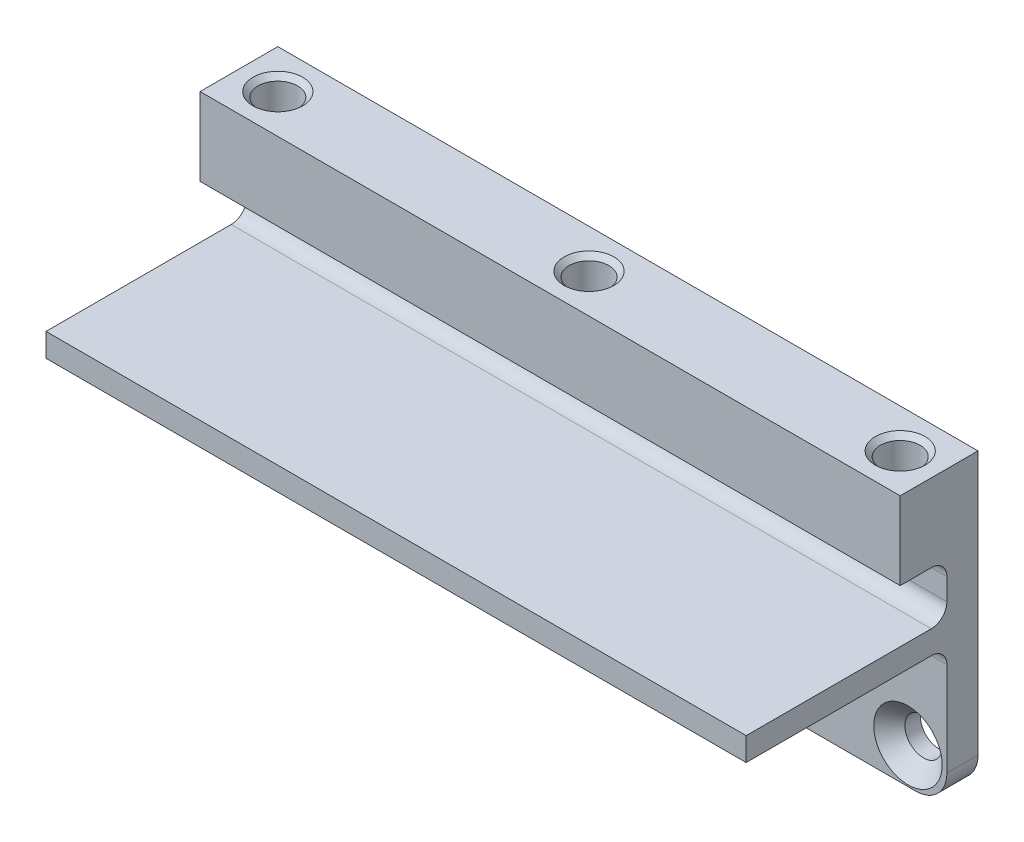
ISO-10303-21;
HEADER;
FILE_DESCRIPTION(('STEP AP214'),'2;1');
FILE_NAME('part.step','',(''),(''),'','','');
FILE_SCHEMA(('AUTOMOTIVE_DESIGN { 1 0 10303 214 1 1 1 1 }'));
ENDSEC;
DATA;
#1=APPLICATION_CONTEXT('core data for automotive mechanical design processes');
#2=APPLICATION_PROTOCOL_DEFINITION('international standard','automotive_design',2000,#1);
#3=PRODUCT_CONTEXT('',#1,'mechanical');
#4=PRODUCT('Part','Part','',(#3));
#5=PRODUCT_RELATED_PRODUCT_CATEGORY('part','',(#4));
#6=PRODUCT_DEFINITION_FORMATION('','',#4);
#7=PRODUCT_DEFINITION_CONTEXT('part definition',#1,'design');
#8=PRODUCT_DEFINITION('design','',#6,#7);
#9=PRODUCT_DEFINITION_SHAPE('','',#8);
#10=(LENGTH_UNIT() NAMED_UNIT(*) SI_UNIT(.MILLI.,.METRE.));
#11=(NAMED_UNIT(*) PLANE_ANGLE_UNIT() SI_UNIT($,.RADIAN.));
#12=(NAMED_UNIT(*) SI_UNIT($,.STERADIAN.) SOLID_ANGLE_UNIT());
#13=UNCERTAINTY_MEASURE_WITH_UNIT(LENGTH_MEASURE(1.E-05),#10,'distance_accuracy_value','');
#14=(GEOMETRIC_REPRESENTATION_CONTEXT(3) GLOBAL_UNCERTAINTY_ASSIGNED_CONTEXT((#13)) GLOBAL_UNIT_ASSIGNED_CONTEXT((#10,
#11,#12)) REPRESENTATION_CONTEXT('',''));
#15=CARTESIAN_POINT('',(0.,0.,0.));
#16=DIRECTION('',(0.,0.,1.));
#17=DIRECTION('',(1.,0.,0.));
#18=AXIS2_PLACEMENT_3D('',#15,#16,#17);
#19=CARTESIAN_POINT('',(22.5,0.,2.));
#20=DIRECTION('',(0.,1.,0.));
#21=DIRECTION('',(0.,0.,1.));
#22=AXIS2_PLACEMENT_3D('',#19,#20,#21);
#23=PLANE('',#22);
#24=DIRECTION('',(-1.,0.,0.));
#25=VECTOR('',#24,1.);
#26=CARTESIAN_POINT('',(22.5,0.,2.));
#27=LINE('',#26,#25);
#28=CARTESIAN_POINT('',(20.5,0.,2.));
#29=VERTEX_POINT('',#28);
#30=CARTESIAN_POINT('',(-20.5,0.,2.));
#31=VERTEX_POINT('',#30);
#32=EDGE_CURVE('E261',#29,#31,#27,.T.);
#33=ORIENTED_EDGE('',*,*,#32,.T.);
#34=DIRECTION('',(0.,0.,-1.));
#35=VECTOR('',#34,1.);
#36=CARTESIAN_POINT('',(-20.5,0.,2.));
#37=LINE('',#36,#35);
#38=CARTESIAN_POINT('',(-20.5,0.,0.));
#39=VERTEX_POINT('',#38);
#40=EDGE_CURVE('E369',#31,#39,#37,.T.);
#41=ORIENTED_EDGE('',*,*,#40,.T.);
#42=DIRECTION('',(-1.,0.,0.));
#43=VECTOR('',#42,1.);
#44=CARTESIAN_POINT('',(22.5,0.,0.));
#45=LINE('',#44,#43);
#46=CARTESIAN_POINT('',(20.5,0.,0.));
#47=VERTEX_POINT('',#46);
#48=EDGE_CURVE('E314',#47,#39,#45,.T.);
#49=ORIENTED_EDGE('',*,*,#48,.F.);
#50=DIRECTION('',(0.,0.,-1.));
#51=VECTOR('',#50,1.);
#52=CARTESIAN_POINT('',(20.5,0.,2.));
#53=LINE('',#52,#51);
#54=EDGE_CURVE('E357',#47,#29,#53,.F.);
#55=ORIENTED_EDGE('',*,*,#54,.T.);
#56=EDGE_LOOP('',(#33,#41,#49,#55));
#57=FACE_BOUND('',#56,.T.);
#58=ADVANCED_FACE('F41',(#57),#23,.F.);
#59=CARTESIAN_POINT('',(22.5,0.,0.));
#60=DIRECTION('',(0.,0.,1.));
#61=DIRECTION('',(1.,0.,0.));
#62=AXIS2_PLACEMENT_3D('',#59,#60,#61);
#63=PLANE('',#62);
#64=CARTESIAN_POINT('',(-20.,2.3,0.));
#65=DIRECTION('',(0.,0.,1.));
#66=DIRECTION('',(1.,0.,0.));
#67=AXIS2_PLACEMENT_3D('',#64,#65,#66);
#68=CIRCLE('',#67,1.19999999999999);
#69=CARTESIAN_POINT('',(-18.8,2.3,0.));
#70=VERTEX_POINT('',#69);
#71=EDGE_CURVE('E211',#70,#70,#68,.T.);
#72=ORIENTED_EDGE('',*,*,#71,.T.);
#73=EDGE_LOOP('',(#72));
#74=FACE_BOUND('',#73,.T.);
#75=CARTESIAN_POINT('',(0.,2.3,0.));
#76=DIRECTION('',(0.,0.,1.));
#77=DIRECTION('',(1.,0.,0.));
#78=AXIS2_PLACEMENT_3D('',#75,#76,#77);
#79=CIRCLE('',#78,1.19999999999999);
#80=CARTESIAN_POINT('',(1.19999999999999,2.3,0.));
#81=VERTEX_POINT('',#80);
#82=EDGE_CURVE('E220',#81,#81,#79,.T.);
#83=ORIENTED_EDGE('',*,*,#82,.T.);
#84=EDGE_LOOP('',(#83));
#85=FACE_BOUND('',#84,.T.);
#86=CARTESIAN_POINT('',(20.,2.3,0.));
#87=DIRECTION('',(0.,0.,1.));
#88=DIRECTION('',(1.,0.,0.));
#89=AXIS2_PLACEMENT_3D('',#86,#87,#88);
#90=CIRCLE('',#89,1.19999999999999);
#91=CARTESIAN_POINT('',(21.2,2.3,0.));
#92=VERTEX_POINT('',#91);
#93=EDGE_CURVE('E229',#92,#92,#90,.T.);
#94=ORIENTED_EDGE('',*,*,#93,.T.);
#95=EDGE_LOOP('',(#94));
#96=FACE_BOUND('',#95,.T.);
#97=ORIENTED_EDGE('',*,*,#48,.T.);
#98=CARTESIAN_POINT('',(-20.5,2.,0.));
#99=DIRECTION('',(0.,0.,1.));
#100=DIRECTION('',(1.,0.,0.));
#101=AXIS2_PLACEMENT_3D('',#98,#99,#100);
#102=CIRCLE('',#101,2.);
#103=CARTESIAN_POINT('',(-22.5,2.,0.));
#104=VERTEX_POINT('',#103);
#105=EDGE_CURVE('E376',#39,#104,#102,.F.);
#106=ORIENTED_EDGE('',*,*,#105,.T.);
#107=DIRECTION('',(0.,1.,0.));
#108=VECTOR('',#107,1.);
#109=CARTESIAN_POINT('',(-22.5,0.,0.));
#110=LINE('',#109,#108);
#111=CARTESIAN_POINT('',(-22.5,18.94,0.));
#112=VERTEX_POINT('',#111);
#113=EDGE_CURVE('E262',#104,#112,#110,.T.);
#114=ORIENTED_EDGE('',*,*,#113,.T.);
#115=DIRECTION('',(-1.,0.,0.));
#116=VECTOR('',#115,1.);
#117=CARTESIAN_POINT('',(22.5,18.94,0.));
#118=LINE('',#117,#116);
#119=CARTESIAN_POINT('',(22.5,18.94,0.));
#120=VERTEX_POINT('',#119);
#121=EDGE_CURVE('E310',#120,#112,#118,.T.);
#122=ORIENTED_EDGE('',*,*,#121,.F.);
#123=DIRECTION('',(0.,1.,0.));
#124=VECTOR('',#123,1.);
#125=CARTESIAN_POINT('',(22.5,0.,0.));
#126=LINE('',#125,#124);
#127=CARTESIAN_POINT('',(22.5,2.,0.));
#128=VERTEX_POINT('',#127);
#129=EDGE_CURVE('E230',#128,#120,#126,.T.);
#130=ORIENTED_EDGE('',*,*,#129,.F.);
#131=CARTESIAN_POINT('',(20.5,2.,0.));
#132=DIRECTION('',(0.,0.,1.));
#133=DIRECTION('',(1.,0.,0.));
#134=AXIS2_PLACEMENT_3D('',#131,#132,#133);
#135=CIRCLE('',#134,2.);
#136=EDGE_CURVE('E373',#128,#47,#135,.F.);
#137=ORIENTED_EDGE('',*,*,#136,.T.);
#138=EDGE_LOOP('',(#97,#106,#114,#122,#130,#137));
#139=FACE_BOUND('',#138,.T.);
#140=ADVANCED_FACE('F392',(#74,#85,#96,#139),#63,.F.);
#141=CARTESIAN_POINT('',(22.5,18.94,0.));
#142=DIRECTION('',(0.,-1.,0.));
#143=DIRECTION('',(0.,0.,-1.));
#144=AXIS2_PLACEMENT_3D('',#141,#142,#143);
#145=PLANE('',#144);
#146=CARTESIAN_POINT('',(-20.,18.94,2.5));
#147=DIRECTION('',(0.,1.,0.));
#148=DIRECTION('',(0.,0.,1.));
#149=AXIS2_PLACEMENT_3D('',#146,#147,#148);
#150=CIRCLE('',#149,1.5975);
#151=CARTESIAN_POINT('',(-20.,18.94,4.0975));
#152=VERTEX_POINT('',#151);
#153=EDGE_CURVE('E180',#152,#152,#150,.T.);
#154=ORIENTED_EDGE('',*,*,#153,.F.);
#155=EDGE_LOOP('',(#154));
#156=FACE_BOUND('',#155,.T.);
#157=CARTESIAN_POINT('',(0.,18.94,2.5));
#158=DIRECTION('',(0.,1.,0.));
#159=DIRECTION('',(0.,0.,1.));
#160=AXIS2_PLACEMENT_3D('',#157,#158,#159);
#161=CIRCLE('',#160,1.5975);
#162=CARTESIAN_POINT('',(0.,18.94,4.0975));
#163=VERTEX_POINT('',#162);
#164=EDGE_CURVE('E171',#163,#163,#161,.T.);
#165=ORIENTED_EDGE('',*,*,#164,.F.);
#166=EDGE_LOOP('',(#165));
#167=FACE_BOUND('',#166,.T.);
#168=CARTESIAN_POINT('',(20.,18.94,2.5));
#169=DIRECTION('',(0.,1.,0.));
#170=DIRECTION('',(0.,0.,1.));
#171=AXIS2_PLACEMENT_3D('',#168,#169,#170);
#172=CIRCLE('',#171,1.5975);
#173=CARTESIAN_POINT('',(20.,18.94,4.0975));
#174=VERTEX_POINT('',#173);
#175=EDGE_CURVE('E191',#174,#174,#172,.T.);
#176=ORIENTED_EDGE('',*,*,#175,.F.);
#177=EDGE_LOOP('',(#176));
#178=FACE_BOUND('',#177,.T.);
#179=DIRECTION('',(0.,0.,1.));
#180=VECTOR('',#179,1.);
#181=CARTESIAN_POINT('',(-22.5,18.94,0.));
#182=LINE('',#181,#180);
#183=CARTESIAN_POINT('',(-22.5,18.94,5.));
#184=VERTEX_POINT('',#183);
#185=EDGE_CURVE('E265',#112,#184,#182,.T.);
#186=ORIENTED_EDGE('',*,*,#185,.T.);
#187=DIRECTION('',(-1.,0.,0.));
#188=VECTOR('',#187,1.);
#189=CARTESIAN_POINT('',(22.5,18.94,5.));
#190=LINE('',#189,#188);
#191=CARTESIAN_POINT('',(22.5,18.94,5.));
#192=VERTEX_POINT('',#191);
#193=EDGE_CURVE('E306',#192,#184,#190,.T.);
#194=ORIENTED_EDGE('',*,*,#193,.F.);
#195=DIRECTION('',(0.,0.,1.));
#196=VECTOR('',#195,1.);
#197=CARTESIAN_POINT('',(22.5,18.94,0.));
#198=LINE('',#197,#196);
#199=EDGE_CURVE('E233',#120,#192,#198,.T.);
#200=ORIENTED_EDGE('',*,*,#199,.F.);
#201=ORIENTED_EDGE('',*,*,#121,.T.);
#202=EDGE_LOOP('',(#186,#194,#200,#201));
#203=FACE_BOUND('',#202,.T.);
#204=ADVANCED_FACE('F400',(#156,#167,#178,#203),#145,.F.);
#205=CARTESIAN_POINT('',(22.5,18.94,5.));
#206=DIRECTION('',(0.,0.,-1.));
#207=DIRECTION('',(-1.,0.,0.));
#208=AXIS2_PLACEMENT_3D('',#205,#206,#207);
#209=PLANE('',#208);
#210=DIRECTION('',(0.,-1.,0.));
#211=VECTOR('',#210,1.);
#212=CARTESIAN_POINT('',(-22.5,18.94,5.));
#213=LINE('',#212,#211);
#214=CARTESIAN_POINT('',(-22.5,13.94,5.));
#215=VERTEX_POINT('',#214);
#216=EDGE_CURVE('E268',#184,#215,#213,.T.);
#217=ORIENTED_EDGE('',*,*,#216,.T.);
#218=DIRECTION('',(-1.,0.,0.));
#219=VECTOR('',#218,1.);
#220=CARTESIAN_POINT('',(22.5,13.94,5.));
#221=LINE('',#220,#219);
#222=CARTESIAN_POINT('',(22.5,13.94,5.));
#223=VERTEX_POINT('',#222);
#224=EDGE_CURVE('E302',#223,#215,#221,.T.);
#225=ORIENTED_EDGE('',*,*,#224,.F.);
#226=DIRECTION('',(0.,-1.,0.));
#227=VECTOR('',#226,1.);
#228=CARTESIAN_POINT('',(22.5,18.94,5.));
#229=LINE('',#228,#227);
#230=EDGE_CURVE('E237',#192,#223,#229,.T.);
#231=ORIENTED_EDGE('',*,*,#230,.F.);
#232=ORIENTED_EDGE('',*,*,#193,.T.);
#233=EDGE_LOOP('',(#217,#225,#231,#232));
#234=FACE_BOUND('',#233,.T.);
#235=ADVANCED_FACE('F404',(#234),#209,.F.);
#236=CARTESIAN_POINT('',(22.5,13.94,5.));
#237=DIRECTION('',(0.,1.,0.));
#238=DIRECTION('',(0.,0.,1.));
#239=AXIS2_PLACEMENT_3D('',#236,#237,#238);
#240=PLANE('',#239);
#241=DIRECTION('',(0.,0.,-1.));
#242=VECTOR('',#241,1.);
#243=CARTESIAN_POINT('',(-22.5,13.94,5.));
#244=LINE('',#243,#242);
#245=CARTESIAN_POINT('',(-22.5,13.94,3.));
#246=VERTEX_POINT('',#245);
#247=EDGE_CURVE('E271',#215,#246,#244,.T.);
#248=ORIENTED_EDGE('',*,*,#247,.T.);
#249=DIRECTION('',(-1.,0.,0.));
#250=VECTOR('',#249,1.);
#251=CARTESIAN_POINT('',(22.5,13.94,3.));
#252=LINE('',#251,#250);
#253=CARTESIAN_POINT('',(22.5,13.94,3.));
#254=VERTEX_POINT('',#253);
#255=EDGE_CURVE('E336',#246,#254,#252,.F.);
#256=ORIENTED_EDGE('',*,*,#255,.T.);
#257=DIRECTION('',(0.,0.,-1.));
#258=VECTOR('',#257,1.);
#259=CARTESIAN_POINT('',(22.5,13.94,5.));
#260=LINE('',#259,#258);
#261=EDGE_CURVE('E240',#223,#254,#260,.T.);
#262=ORIENTED_EDGE('',*,*,#261,.F.);
#263=ORIENTED_EDGE('',*,*,#224,.T.);
#264=EDGE_LOOP('',(#248,#256,#262,#263));
#265=FACE_BOUND('',#264,.T.);
#266=ADVANCED_FACE('F491',(#265),#240,.F.);
#267=CARTESIAN_POINT('',(22.5,13.94,2.));
#268=DIRECTION('',(0.,0.,-1.));
#269=DIRECTION('',(0.,1.,0.));
#270=AXIS2_PLACEMENT_3D('',#267,#268,#269);
#271=PLANE('',#270);
#272=DIRECTION('',(0.,-1.,0.));
#273=VECTOR('',#272,1.);
#274=CARTESIAN_POINT('',(-22.5,13.94,2.));
#275=LINE('',#274,#273);
#276=CARTESIAN_POINT('',(-22.5,12.94,2.));
#277=VERTEX_POINT('',#276);
#278=CARTESIAN_POINT('',(-22.5,11.54,2.));
#279=VERTEX_POINT('',#278);
#280=EDGE_CURVE('E275',#277,#279,#275,.T.);
#281=ORIENTED_EDGE('',*,*,#280,.T.);
#282=DIRECTION('',(-1.,0.,0.));
#283=VECTOR('',#282,1.);
#284=CARTESIAN_POINT('',(22.5,11.54,2.));
#285=LINE('',#284,#283);
#286=CARTESIAN_POINT('',(22.5,11.54,2.));
#287=VERTEX_POINT('',#286);
#288=EDGE_CURVE('E326',#279,#287,#285,.F.);
#289=ORIENTED_EDGE('',*,*,#288,.T.);
#290=DIRECTION('',(0.,-1.,0.));
#291=VECTOR('',#290,1.);
#292=CARTESIAN_POINT('',(22.5,13.94,2.));
#293=LINE('',#292,#291);
#294=CARTESIAN_POINT('',(22.5,12.94,2.));
#295=VERTEX_POINT('',#294);
#296=EDGE_CURVE('E244',#295,#287,#293,.T.);
#297=ORIENTED_EDGE('',*,*,#296,.F.);
#298=DIRECTION('',(-1.,0.,0.));
#299=VECTOR('',#298,1.);
#300=CARTESIAN_POINT('',(-22.5,12.94,2.));
#301=LINE('',#300,#299);
#302=EDGE_CURVE('E322',#295,#277,#301,.T.);
#303=ORIENTED_EDGE('',*,*,#302,.T.);
#304=EDGE_LOOP('',(#281,#289,#297,#303));
#305=FACE_BOUND('',#304,.T.);
#306=ADVANCED_FACE('F455',(#305),#271,.F.);
#307=CARTESIAN_POINT('',(22.5,10.54,2.));
#308=DIRECTION('',(0.,-1.,0.));
#309=DIRECTION('',(0.,0.,-1.));
#310=AXIS2_PLACEMENT_3D('',#307,#308,#309);
#311=PLANE('',#310);
#312=DIRECTION('',(0.,0.,1.));
#313=VECTOR('',#312,1.);
#314=CARTESIAN_POINT('',(22.5,10.54,2.));
#315=LINE('',#314,#313);
#316=CARTESIAN_POINT('',(22.5,10.54,3.));
#317=VERTEX_POINT('',#316);
#318=CARTESIAN_POINT('',(22.5,10.54,14.9));
#319=VERTEX_POINT('',#318);
#320=EDGE_CURVE('E248',#317,#319,#315,.T.);
#321=ORIENTED_EDGE('',*,*,#320,.F.);
#322=DIRECTION('',(-1.,0.,0.));
#323=VECTOR('',#322,1.);
#324=CARTESIAN_POINT('',(-22.5,10.54,3.));
#325=LINE('',#324,#323);
#326=CARTESIAN_POINT('',(-22.5,10.54,3.));
#327=VERTEX_POINT('',#326);
#328=EDGE_CURVE('E318',#317,#327,#325,.T.);
#329=ORIENTED_EDGE('',*,*,#328,.T.);
#330=DIRECTION('',(0.,0.,1.));
#331=VECTOR('',#330,1.);
#332=CARTESIAN_POINT('',(-22.5,10.54,2.));
#333=LINE('',#332,#331);
#334=CARTESIAN_POINT('',(-22.5,10.54,14.9));
#335=VERTEX_POINT('',#334);
#336=EDGE_CURVE('E279',#327,#335,#333,.T.);
#337=ORIENTED_EDGE('',*,*,#336,.T.);
#338=DIRECTION('',(-1.,0.,0.));
#339=VECTOR('',#338,1.);
#340=CARTESIAN_POINT('',(22.5,10.54,14.9));
#341=LINE('',#340,#339);
#342=EDGE_CURVE('E298',#319,#335,#341,.T.);
#343=ORIENTED_EDGE('',*,*,#342,.F.);
#344=EDGE_LOOP('',(#321,#329,#337,#343));
#345=FACE_BOUND('',#344,.T.);
#346=ADVANCED_FACE('F462',(#345),#311,.F.);
#347=CARTESIAN_POINT('',(22.5,10.54,14.9));
#348=DIRECTION('',(0.,0.,-1.));
#349=DIRECTION('',(0.,1.,0.));
#350=AXIS2_PLACEMENT_3D('',#347,#348,#349);
#351=PLANE('',#350);
#352=DIRECTION('',(0.,-1.,0.));
#353=VECTOR('',#352,1.);
#354=CARTESIAN_POINT('',(-22.5,10.54,14.9));
#355=LINE('',#354,#353);
#356=CARTESIAN_POINT('',(-22.5,9.04,14.9));
#357=VERTEX_POINT('',#356);
#358=EDGE_CURVE('E282',#335,#357,#355,.T.);
#359=ORIENTED_EDGE('',*,*,#358,.T.);
#360=DIRECTION('',(-1.,0.,0.));
#361=VECTOR('',#360,1.);
#362=CARTESIAN_POINT('',(22.5,9.04,14.9));
#363=LINE('',#362,#361);
#364=CARTESIAN_POINT('',(22.5,9.04,14.9));
#365=VERTEX_POINT('',#364);
#366=EDGE_CURVE('E294',#365,#357,#363,.T.);
#367=ORIENTED_EDGE('',*,*,#366,.F.);
#368=DIRECTION('',(0.,-1.,0.));
#369=VECTOR('',#368,1.);
#370=CARTESIAN_POINT('',(22.5,10.54,14.9));
#371=LINE('',#370,#369);
#372=EDGE_CURVE('E251',#319,#365,#371,.T.);
#373=ORIENTED_EDGE('',*,*,#372,.F.);
#374=ORIENTED_EDGE('',*,*,#342,.T.);
#375=EDGE_LOOP('',(#359,#367,#373,#374));
#376=FACE_BOUND('',#375,.T.);
#377=ADVANCED_FACE('F468',(#376),#351,.F.);
#378=CARTESIAN_POINT('',(22.5,9.04,14.9));
#379=DIRECTION('',(0.,1.,0.));
#380=DIRECTION('',(0.,0.,1.));
#381=AXIS2_PLACEMENT_3D('',#378,#379,#380);
#382=PLANE('',#381);
#383=DIRECTION('',(0.,0.,-1.));
#384=VECTOR('',#383,1.);
#385=CARTESIAN_POINT('',(-22.5,9.04,14.9));
#386=LINE('',#385,#384);
#387=CARTESIAN_POINT('',(-22.5,9.04,3.));
#388=VERTEX_POINT('',#387);
#389=EDGE_CURVE('E285',#357,#388,#386,.T.);
#390=ORIENTED_EDGE('',*,*,#389,.T.);
#391=DIRECTION('',(-1.,0.,0.));
#392=VECTOR('',#391,1.);
#393=CARTESIAN_POINT('',(22.5,9.04,3.));
#394=LINE('',#393,#392);
#395=CARTESIAN_POINT('',(22.5,9.04,3.));
#396=VERTEX_POINT('',#395);
#397=EDGE_CURVE('E333',#388,#396,#394,.F.);
#398=ORIENTED_EDGE('',*,*,#397,.T.);
#399=DIRECTION('',(0.,0.,-1.));
#400=VECTOR('',#399,1.);
#401=CARTESIAN_POINT('',(22.5,9.04,14.9));
#402=LINE('',#401,#400);
#403=EDGE_CURVE('E254',#365,#396,#402,.T.);
#404=ORIENTED_EDGE('',*,*,#403,.F.);
#405=ORIENTED_EDGE('',*,*,#366,.T.);
#406=EDGE_LOOP('',(#390,#398,#404,#405));
#407=FACE_BOUND('',#406,.T.);
#408=ADVANCED_FACE('F475',(#407),#382,.F.);
#409=CARTESIAN_POINT('',(22.5,9.04,2.));
#410=DIRECTION('',(0.,0.,-1.));
#411=DIRECTION('',(-1.,0.,0.));
#412=AXIS2_PLACEMENT_3D('',#409,#410,#411);
#413=PLANE('',#412);
#414=CARTESIAN_POINT('',(-20.,2.3,2.));
#415=DIRECTION('',(0.,0.,1.));
#416=DIRECTION('',(1.,0.,0.));
#417=AXIS2_PLACEMENT_3D('',#414,#415,#416);
#418=CIRCLE('',#417,2.2);
#419=CARTESIAN_POINT('',(-17.8,2.3,2.));
#420=VERTEX_POINT('',#419);
#421=EDGE_CURVE('E203',#420,#420,#418,.T.);
#422=ORIENTED_EDGE('',*,*,#421,.F.);
#423=EDGE_LOOP('',(#422));
#424=FACE_BOUND('',#423,.T.);
#425=CARTESIAN_POINT('',(0.,2.3,2.));
#426=DIRECTION('',(0.,0.,1.));
#427=DIRECTION('',(1.,0.,0.));
#428=AXIS2_PLACEMENT_3D('',#425,#426,#427);
#429=CIRCLE('',#428,2.2);
#430=CARTESIAN_POINT('',(2.2,2.3,2.));
#431=VERTEX_POINT('',#430);
#432=EDGE_CURVE('E212',#431,#431,#429,.T.);
#433=ORIENTED_EDGE('',*,*,#432,.F.);
#434=EDGE_LOOP('',(#433));
#435=FACE_BOUND('',#434,.T.);
#436=CARTESIAN_POINT('',(20.,2.3,2.));
#437=DIRECTION('',(0.,0.,1.));
#438=DIRECTION('',(1.,0.,0.));
#439=AXIS2_PLACEMENT_3D('',#436,#437,#438);
#440=CIRCLE('',#439,2.2);
#441=CARTESIAN_POINT('',(22.2,2.3,2.));
#442=VERTEX_POINT('',#441);
#443=EDGE_CURVE('E221',#442,#442,#440,.T.);
#444=ORIENTED_EDGE('',*,*,#443,.F.);
#445=EDGE_LOOP('',(#444));
#446=FACE_BOUND('',#445,.T.);
#447=DIRECTION('',(0.,-1.,0.));
#448=VECTOR('',#447,1.);
#449=CARTESIAN_POINT('',(-22.5,9.04,2.));
#450=LINE('',#449,#448);
#451=CARTESIAN_POINT('',(-22.5,8.04,2.));
#452=VERTEX_POINT('',#451);
#453=CARTESIAN_POINT('',(-22.5,2.,2.));
#454=VERTEX_POINT('',#453);
#455=EDGE_CURVE('E234',#452,#454,#450,.T.);
#456=ORIENTED_EDGE('',*,*,#455,.T.);
#457=CARTESIAN_POINT('',(-20.5,2.,2.));
#458=DIRECTION('',(0.,0.,-1.));
#459=DIRECTION('',(-1.,0.,0.));
#460=AXIS2_PLACEMENT_3D('',#457,#458,#459);
#461=CIRCLE('',#460,2.);
#462=EDGE_CURVE('E50',#454,#31,#461,.F.);
#463=ORIENTED_EDGE('',*,*,#462,.T.);
#464=ORIENTED_EDGE('',*,*,#32,.F.);
#465=CARTESIAN_POINT('',(20.5,2.,2.));
#466=DIRECTION('',(0.,0.,-1.));
#467=DIRECTION('',(-1.,0.,0.));
#468=AXIS2_PLACEMENT_3D('',#465,#466,#467);
#469=CIRCLE('',#468,2.);
#470=CARTESIAN_POINT('',(22.5,2.,2.));
#471=VERTEX_POINT('',#470);
#472=EDGE_CURVE('E57',#29,#471,#469,.F.);
#473=ORIENTED_EDGE('',*,*,#472,.T.);
#474=DIRECTION('',(0.,-1.,0.));
#475=VECTOR('',#474,1.);
#476=CARTESIAN_POINT('',(22.5,9.04,2.));
#477=LINE('',#476,#475);
#478=CARTESIAN_POINT('',(22.5,8.04,2.));
#479=VERTEX_POINT('',#478);
#480=EDGE_CURVE('E258',#479,#471,#477,.T.);
#481=ORIENTED_EDGE('',*,*,#480,.F.);
#482=DIRECTION('',(-1.,0.,0.));
#483=VECTOR('',#482,1.);
#484=CARTESIAN_POINT('',(-22.5,8.04,2.));
#485=LINE('',#484,#483);
#486=EDGE_CURVE('E329',#479,#452,#485,.T.);
#487=ORIENTED_EDGE('',*,*,#486,.T.);
#488=EDGE_LOOP('',(#456,#463,#464,#473,#481,#487));
#489=FACE_BOUND('',#488,.T.);
#490=ADVANCED_FACE('F384',(#424,#435,#446,#489),#413,.F.);
#491=CARTESIAN_POINT('',(22.5,0.,0.));
#492=DIRECTION('',(1.,0.,0.));
#493=DIRECTION('',(0.,0.,-1.));
#494=AXIS2_PLACEMENT_3D('',#491,#492,#493);
#495=PLANE('',#494);
#496=ORIENTED_EDGE('',*,*,#480,.T.);
#497=DIRECTION('',(0.,0.,-1.));
#498=VECTOR('',#497,1.);
#499=CARTESIAN_POINT('',(22.5,2.,0.));
#500=LINE('',#499,#498);
#501=EDGE_CURVE('E11',#471,#128,#500,.T.);
#502=ORIENTED_EDGE('',*,*,#501,.T.);
#503=ORIENTED_EDGE('',*,*,#129,.T.);
#504=ORIENTED_EDGE('',*,*,#199,.T.);
#505=ORIENTED_EDGE('',*,*,#230,.T.);
#506=ORIENTED_EDGE('',*,*,#261,.T.);
#507=CARTESIAN_POINT('',(22.5,12.94,3.));
#508=DIRECTION('',(1.,0.,0.));
#509=DIRECTION('',(0.,0.,-1.));
#510=AXIS2_PLACEMENT_3D('',#507,#508,#509);
#511=CIRCLE('',#510,1.);
#512=EDGE_CURVE('E354',#254,#295,#511,.F.);
#513=ORIENTED_EDGE('',*,*,#512,.T.);
#514=ORIENTED_EDGE('',*,*,#296,.T.);
#515=CARTESIAN_POINT('',(22.5,11.54,3.));
#516=DIRECTION('',(1.,0.,0.));
#517=DIRECTION('',(0.,0.,-1.));
#518=AXIS2_PLACEMENT_3D('',#515,#516,#517);
#519=CIRCLE('',#518,1.);
#520=EDGE_CURVE('E342',#287,#317,#519,.F.);
#521=ORIENTED_EDGE('',*,*,#520,.T.);
#522=ORIENTED_EDGE('',*,*,#320,.T.);
#523=ORIENTED_EDGE('',*,*,#372,.T.);
#524=ORIENTED_EDGE('',*,*,#403,.T.);
#525=CARTESIAN_POINT('',(22.5,8.04,3.));
#526=DIRECTION('',(1.,0.,0.));
#527=DIRECTION('',(0.,0.,-1.));
#528=AXIS2_PLACEMENT_3D('',#525,#526,#527);
#529=CIRCLE('',#528,1.);
#530=EDGE_CURVE('E348',#396,#479,#529,.F.);
#531=ORIENTED_EDGE('',*,*,#530,.T.);
#532=EDGE_LOOP('',(#496,#502,#503,#504,#505,#506,#513,#514,#521,#522,#523,#524,#531));
#533=FACE_BOUND('',#532,.T.);
#534=ADVANCED_FACE('F408',(#533),#495,.T.);
#535=CARTESIAN_POINT('',(-22.5,0.,0.));
#536=DIRECTION('',(1.,0.,0.));
#537=DIRECTION('',(0.,0.,-1.));
#538=AXIS2_PLACEMENT_3D('',#535,#536,#537);
#539=PLANE('',#538);
#540=ORIENTED_EDGE('',*,*,#113,.F.);
#541=DIRECTION('',(0.,0.,-1.));
#542=VECTOR('',#541,1.);
#543=CARTESIAN_POINT('',(-22.5,2.,0.));
#544=LINE('',#543,#542);
#545=EDGE_CURVE('E65',#104,#454,#544,.F.);
#546=ORIENTED_EDGE('',*,*,#545,.T.);
#547=ORIENTED_EDGE('',*,*,#455,.F.);
#548=CARTESIAN_POINT('',(-22.5,8.04,3.));
#549=DIRECTION('',(1.,0.,0.));
#550=DIRECTION('',(0.,0.,-1.));
#551=AXIS2_PLACEMENT_3D('',#548,#549,#550);
#552=CIRCLE('',#551,1.);
#553=EDGE_CURVE('E345',#452,#388,#552,.T.);
#554=ORIENTED_EDGE('',*,*,#553,.T.);
#555=ORIENTED_EDGE('',*,*,#389,.F.);
#556=ORIENTED_EDGE('',*,*,#358,.F.);
#557=ORIENTED_EDGE('',*,*,#336,.F.);
#558=CARTESIAN_POINT('',(-22.5,11.54,3.));
#559=DIRECTION('',(1.,0.,0.));
#560=DIRECTION('',(0.,0.,-1.));
#561=AXIS2_PLACEMENT_3D('',#558,#559,#560);
#562=CIRCLE('',#561,1.);
#563=EDGE_CURVE('E339',#327,#279,#562,.T.);
#564=ORIENTED_EDGE('',*,*,#563,.T.);
#565=ORIENTED_EDGE('',*,*,#280,.F.);
#566=CARTESIAN_POINT('',(-22.5,12.94,3.));
#567=DIRECTION('',(1.,0.,0.));
#568=DIRECTION('',(0.,0.,-1.));
#569=AXIS2_PLACEMENT_3D('',#566,#567,#568);
#570=CIRCLE('',#569,1.);
#571=EDGE_CURVE('E351',#277,#246,#570,.T.);
#572=ORIENTED_EDGE('',*,*,#571,.T.);
#573=ORIENTED_EDGE('',*,*,#247,.F.);
#574=ORIENTED_EDGE('',*,*,#216,.F.);
#575=ORIENTED_EDGE('',*,*,#185,.F.);
#576=EDGE_LOOP('',(#540,#546,#547,#554,#555,#556,#557,#564,#565,#572,#573,#574,#575));
#577=FACE_BOUND('',#576,.T.);
#578=ADVANCED_FACE('F395',(#577),#539,.F.);
#579=CARTESIAN_POINT('',(22.5,11.54,3.));
#580=DIRECTION('',(1.,0.,0.));
#581=DIRECTION('',(0.,0.,-1.));
#582=AXIS2_PLACEMENT_3D('',#579,#580,#581);
#583=CYLINDRICAL_SURFACE('',#582,1.);
#584=ORIENTED_EDGE('',*,*,#520,.F.);
#585=ORIENTED_EDGE('',*,*,#288,.F.);
#586=ORIENTED_EDGE('',*,*,#563,.F.);
#587=ORIENTED_EDGE('',*,*,#328,.F.);
#588=EDGE_LOOP('',(#584,#585,#586,#587));
#589=FACE_BOUND('',#588,.T.);
#590=ADVANCED_FACE('F432',(#589),#583,.F.);
#591=CARTESIAN_POINT('',(22.5,8.04,3.));
#592=DIRECTION('',(1.,0.,0.));
#593=DIRECTION('',(0.,0.,-1.));
#594=AXIS2_PLACEMENT_3D('',#591,#592,#593);
#595=CYLINDRICAL_SURFACE('',#594,1.);
#596=ORIENTED_EDGE('',*,*,#530,.F.);
#597=ORIENTED_EDGE('',*,*,#397,.F.);
#598=ORIENTED_EDGE('',*,*,#553,.F.);
#599=ORIENTED_EDGE('',*,*,#486,.F.);
#600=EDGE_LOOP('',(#596,#597,#598,#599));
#601=FACE_BOUND('',#600,.T.);
#602=ADVANCED_FACE('F435',(#601),#595,.F.);
#603=CARTESIAN_POINT('',(22.5,12.94,3.));
#604=DIRECTION('',(1.,0.,0.));
#605=DIRECTION('',(0.,0.,-1.));
#606=AXIS2_PLACEMENT_3D('',#603,#604,#605);
#607=CYLINDRICAL_SURFACE('',#606,1.);
#608=ORIENTED_EDGE('',*,*,#512,.F.);
#609=ORIENTED_EDGE('',*,*,#255,.F.);
#610=ORIENTED_EDGE('',*,*,#571,.F.);
#611=ORIENTED_EDGE('',*,*,#302,.F.);
#612=EDGE_LOOP('',(#608,#609,#610,#611));
#613=FACE_BOUND('',#612,.T.);
#614=ADVANCED_FACE('F439',(#613),#607,.F.);
#615=CARTESIAN_POINT('',(20.,2.3,2.));
#616=DIRECTION('',(0.,0.,1.));
#617=DIRECTION('',(1.,0.,0.));
#618=AXIS2_PLACEMENT_3D('',#615,#616,#617);
#619=CYLINDRICAL_SURFACE('',#618,1.19999999999999);
#620=CARTESIAN_POINT('',(20.,2.3,0.999999999999999));
#621=DIRECTION('',(0.,0.,1.));
#622=DIRECTION('',(1.,0.,0.));
#623=AXIS2_PLACEMENT_3D('',#620,#621,#622);
#624=CIRCLE('',#623,1.2);
#625=CARTESIAN_POINT('',(21.2,2.3,0.999999999999999));
#626=VERTEX_POINT('',#625);
#627=EDGE_CURVE('E225',#626,#626,#624,.T.);
#628=ORIENTED_EDGE('',*,*,#627,.T.);
#629=EDGE_LOOP('',(#628));
#630=FACE_BOUND('',#629,.T.);
#631=ORIENTED_EDGE('',*,*,#93,.F.);
#632=EDGE_LOOP('',(#631));
#633=FACE_BOUND('',#632,.T.);
#634=ADVANCED_FACE('F442',(#630,#633),#619,.F.);
#635=CARTESIAN_POINT('',(20.,2.3,2.));
#636=DIRECTION('',(0.,0.,1.));
#637=DIRECTION('',(1.,0.,0.));
#638=AXIS2_PLACEMENT_3D('',#635,#636,#637);
#639=CONICAL_SURFACE('',#638,2.2,0.785398163397447);
#640=ORIENTED_EDGE('',*,*,#627,.F.);
#641=EDGE_LOOP('',(#640));
#642=FACE_BOUND('',#641,.T.);
#643=ORIENTED_EDGE('',*,*,#443,.T.);
#644=EDGE_LOOP('',(#643));
#645=FACE_BOUND('',#644,.T.);
#646=ADVANCED_FACE('F447',(#642,#645),#639,.F.);
#647=CARTESIAN_POINT('',(0.,2.3,2.));
#648=DIRECTION('',(0.,0.,1.));
#649=DIRECTION('',(1.,0.,0.));
#650=AXIS2_PLACEMENT_3D('',#647,#648,#649);
#651=CYLINDRICAL_SURFACE('',#650,1.19999999999999);
#652=CARTESIAN_POINT('',(0.,2.3,0.999999999999999));
#653=DIRECTION('',(0.,0.,1.));
#654=DIRECTION('',(1.,0.,0.));
#655=AXIS2_PLACEMENT_3D('',#652,#653,#654);
#656=CIRCLE('',#655,1.2);
#657=CARTESIAN_POINT('',(1.2,2.3,0.999999999999999));
#658=VERTEX_POINT('',#657);
#659=EDGE_CURVE('E216',#658,#658,#656,.T.);
#660=ORIENTED_EDGE('',*,*,#659,.T.);
#661=EDGE_LOOP('',(#660));
#662=FACE_BOUND('',#661,.T.);
#663=ORIENTED_EDGE('',*,*,#82,.F.);
#664=EDGE_LOOP('',(#663));
#665=FACE_BOUND('',#664,.T.);
#666=ADVANCED_FACE('F534',(#662,#665),#651,.F.);
#667=CARTESIAN_POINT('',(0.,2.3,2.));
#668=DIRECTION('',(0.,0.,1.));
#669=DIRECTION('',(1.,0.,0.));
#670=AXIS2_PLACEMENT_3D('',#667,#668,#669);
#671=CONICAL_SURFACE('',#670,2.2,0.785398163397448);
#672=ORIENTED_EDGE('',*,*,#659,.F.);
#673=EDGE_LOOP('',(#672));
#674=FACE_BOUND('',#673,.T.);
#675=ORIENTED_EDGE('',*,*,#432,.T.);
#676=EDGE_LOOP('',(#675));
#677=FACE_BOUND('',#676,.T.);
#678=ADVANCED_FACE('F530',(#674,#677),#671,.F.);
#679=CARTESIAN_POINT('',(-20.,2.3,2.));
#680=DIRECTION('',(0.,0.,1.));
#681=DIRECTION('',(1.,0.,0.));
#682=AXIS2_PLACEMENT_3D('',#679,#680,#681);
#683=CYLINDRICAL_SURFACE('',#682,1.19999999999999);
#684=CARTESIAN_POINT('',(-20.,2.3,0.999999999999999));
#685=DIRECTION('',(0.,0.,1.));
#686=DIRECTION('',(1.,0.,0.));
#687=AXIS2_PLACEMENT_3D('',#684,#685,#686);
#688=CIRCLE('',#687,1.2);
#689=CARTESIAN_POINT('',(-18.8,2.3,0.999999999999999));
#690=VERTEX_POINT('',#689);
#691=EDGE_CURVE('E207',#690,#690,#688,.T.);
#692=ORIENTED_EDGE('',*,*,#691,.T.);
#693=EDGE_LOOP('',(#692));
#694=FACE_BOUND('',#693,.T.);
#695=ORIENTED_EDGE('',*,*,#71,.F.);
#696=EDGE_LOOP('',(#695));
#697=FACE_BOUND('',#696,.T.);
#698=ADVANCED_FACE('F526',(#694,#697),#683,.F.);
#699=CARTESIAN_POINT('',(-20.,2.3,2.));
#700=DIRECTION('',(0.,0.,1.));
#701=DIRECTION('',(1.,0.,0.));
#702=AXIS2_PLACEMENT_3D('',#699,#700,#701);
#703=CONICAL_SURFACE('',#702,2.2,0.785398163397447);
#704=ORIENTED_EDGE('',*,*,#691,.F.);
#705=EDGE_LOOP('',(#704));
#706=FACE_BOUND('',#705,.T.);
#707=ORIENTED_EDGE('',*,*,#421,.T.);
#708=EDGE_LOOP('',(#707));
#709=FACE_BOUND('',#708,.T.);
#710=ADVANCED_FACE('F422',(#706,#709),#703,.F.);
#711=CARTESIAN_POINT('',(-20.5,2.,2.));
#712=DIRECTION('',(0.,0.,-1.));
#713=DIRECTION('',(-1.,0.,0.));
#714=AXIS2_PLACEMENT_3D('',#711,#712,#713);
#715=CYLINDRICAL_SURFACE('',#714,2.);
#716=ORIENTED_EDGE('',*,*,#462,.F.);
#717=ORIENTED_EDGE('',*,*,#545,.F.);
#718=ORIENTED_EDGE('',*,*,#105,.F.);
#719=ORIENTED_EDGE('',*,*,#40,.F.);
#720=EDGE_LOOP('',(#716,#717,#718,#719));
#721=FACE_BOUND('',#720,.T.);
#722=ADVANCED_FACE('F390',(#721),#715,.T.);
#723=CARTESIAN_POINT('',(20.5,2.,0.));
#724=DIRECTION('',(0.,0.,1.));
#725=DIRECTION('',(1.,0.,0.));
#726=AXIS2_PLACEMENT_3D('',#723,#724,#725);
#727=CYLINDRICAL_SURFACE('',#726,2.);
#728=ORIENTED_EDGE('',*,*,#472,.F.);
#729=ORIENTED_EDGE('',*,*,#54,.F.);
#730=ORIENTED_EDGE('',*,*,#136,.F.);
#731=ORIENTED_EDGE('',*,*,#501,.F.);
#732=EDGE_LOOP('',(#728,#729,#730,#731));
#733=FACE_BOUND('',#732,.T.);
#734=ADVANCED_FACE('F43',(#733),#727,.T.);
#735=CARTESIAN_POINT('',(20.,14.94,2.5));
#736=DIRECTION('',(0.,1.,0.));
#737=DIRECTION('',(0.,0.,1.));
#738=AXIS2_PLACEMENT_3D('',#735,#736,#737);
#739=CONICAL_SURFACE('',#738,1.275,1.02974425867665);
#740=CARTESIAN_POINT('',(20.,14.1739027107399,2.5));
#741=VERTEX_POINT('',#740);
#742=VERTEX_LOOP('',#741);
#743=FACE_BOUND('',#742,.T.);
#744=CARTESIAN_POINT('',(20.,14.94,2.5));
#745=DIRECTION('',(0.,1.,0.));
#746=DIRECTION('',(0.,0.,1.));
#747=AXIS2_PLACEMENT_3D('',#744,#745,#746);
#748=CIRCLE('',#747,1.275);
#749=CARTESIAN_POINT('',(20.,14.94,3.775));
#750=VERTEX_POINT('',#749);
#751=EDGE_CURVE('E199',#750,#750,#748,.T.);
#752=ORIENTED_EDGE('',*,*,#751,.T.);
#753=EDGE_LOOP('',(#752));
#754=FACE_BOUND('',#753,.T.);
#755=ADVANCED_FACE('F414',(#743,#754),#739,.F.);
#756=CARTESIAN_POINT('',(20.,18.94,2.5));
#757=DIRECTION('',(0.,1.,0.));
#758=DIRECTION('',(0.,0.,1.));
#759=AXIS2_PLACEMENT_3D('',#756,#757,#758);
#760=CYLINDRICAL_SURFACE('',#759,1.275);
#761=ORIENTED_EDGE('',*,*,#751,.F.);
#762=EDGE_LOOP('',(#761));
#763=FACE_BOUND('',#762,.T.);
#764=CARTESIAN_POINT('',(20.,18.6175,2.5));
#765=DIRECTION('',(0.,1.,0.));
#766=DIRECTION('',(0.,0.,1.));
#767=AXIS2_PLACEMENT_3D('',#764,#765,#766);
#768=CIRCLE('',#767,1.275);
#769=CARTESIAN_POINT('',(20.,18.6175,3.775));
#770=VERTEX_POINT('',#769);
#771=EDGE_CURVE('E195',#770,#770,#768,.T.);
#772=ORIENTED_EDGE('',*,*,#771,.T.);
#773=EDGE_LOOP('',(#772));
#774=FACE_BOUND('',#773,.T.);
#775=ADVANCED_FACE('F419',(#763,#774),#760,.F.);
#776=CARTESIAN_POINT('',(20.,18.94,2.5));
#777=DIRECTION('',(0.,1.,0.));
#778=DIRECTION('',(0.,0.,1.));
#779=AXIS2_PLACEMENT_3D('',#776,#777,#778);
#780=CONICAL_SURFACE('',#779,1.5975,0.785398163397448);
#781=ORIENTED_EDGE('',*,*,#771,.F.);
#782=EDGE_LOOP('',(#781));
#783=FACE_BOUND('',#782,.T.);
#784=ORIENTED_EDGE('',*,*,#175,.T.);
#785=EDGE_LOOP('',(#784));
#786=FACE_BOUND('',#785,.T.);
#787=ADVANCED_FACE('F507',(#783,#786),#780,.F.);
#788=CARTESIAN_POINT('',(0.,14.94,2.5));
#789=DIRECTION('',(0.,1.,0.));
#790=DIRECTION('',(0.,0.,1.));
#791=AXIS2_PLACEMENT_3D('',#788,#789,#790);
#792=CONICAL_SURFACE('',#791,1.275,1.02974425867665);
#793=CARTESIAN_POINT('',(0.,14.1739027107399,2.5));
#794=VERTEX_POINT('',#793);
#795=VERTEX_LOOP('',#794);
#796=FACE_BOUND('',#795,.T.);
#797=CARTESIAN_POINT('',(0.,14.94,2.5));
#798=DIRECTION('',(0.,1.,0.));
#799=DIRECTION('',(0.,0.,1.));
#800=AXIS2_PLACEMENT_3D('',#797,#798,#799);
#801=CIRCLE('',#800,1.275);
#802=CARTESIAN_POINT('',(0.,14.94,3.775));
#803=VERTEX_POINT('',#802);
#804=EDGE_CURVE('E187',#803,#803,#801,.T.);
#805=ORIENTED_EDGE('',*,*,#804,.T.);
#806=EDGE_LOOP('',(#805));
#807=FACE_BOUND('',#806,.T.);
#808=ADVANCED_FACE('F509',(#796,#807),#792,.F.);
#809=CARTESIAN_POINT('',(0.,18.94,2.5));
#810=DIRECTION('',(0.,1.,0.));
#811=DIRECTION('',(0.,0.,1.));
#812=AXIS2_PLACEMENT_3D('',#809,#810,#811);
#813=CYLINDRICAL_SURFACE('',#812,1.275);
#814=ORIENTED_EDGE('',*,*,#804,.F.);
#815=EDGE_LOOP('',(#814));
#816=FACE_BOUND('',#815,.T.);
#817=CARTESIAN_POINT('',(0.,18.6175,2.5));
#818=DIRECTION('',(0.,1.,0.));
#819=DIRECTION('',(0.,0.,1.));
#820=AXIS2_PLACEMENT_3D('',#817,#818,#819);
#821=CIRCLE('',#820,1.275);
#822=CARTESIAN_POINT('',(0.,18.6175,3.775));
#823=VERTEX_POINT('',#822);
#824=EDGE_CURVE('E177',#823,#823,#821,.T.);
#825=ORIENTED_EDGE('',*,*,#824,.T.);
#826=EDGE_LOOP('',(#825));
#827=FACE_BOUND('',#826,.T.);
#828=ADVANCED_FACE('F516',(#816,#827),#813,.F.);
#829=CARTESIAN_POINT('',(0.,18.94,2.5));
#830=DIRECTION('',(0.,1.,0.));
#831=DIRECTION('',(0.,0.,1.));
#832=AXIS2_PLACEMENT_3D('',#829,#830,#831);
#833=CONICAL_SURFACE('',#832,1.5975,0.78539816339745);
#834=ORIENTED_EDGE('',*,*,#824,.F.);
#835=EDGE_LOOP('',(#834));
#836=FACE_BOUND('',#835,.T.);
#837=ORIENTED_EDGE('',*,*,#164,.T.);
#838=EDGE_LOOP('',(#837));
#839=FACE_BOUND('',#838,.T.);
#840=ADVANCED_FACE('F164',(#836,#839),#833,.F.);
#841=CARTESIAN_POINT('',(-20.,14.94,2.5));
#842=DIRECTION('',(0.,1.,0.));
#843=DIRECTION('',(0.,0.,1.));
#844=AXIS2_PLACEMENT_3D('',#841,#842,#843);
#845=CONICAL_SURFACE('',#844,1.275,1.02974425867665);
#846=CARTESIAN_POINT('',(-20.,14.1739027107399,2.5));
#847=VERTEX_POINT('',#846);
#848=VERTEX_LOOP('',#847);
#849=FACE_BOUND('',#848,.T.);
#850=CARTESIAN_POINT('',(-20.,14.94,2.5));
#851=DIRECTION('',(0.,1.,0.));
#852=DIRECTION('',(0.,0.,1.));
#853=AXIS2_PLACEMENT_3D('',#850,#851,#852);
#854=CIRCLE('',#853,1.275);
#855=CARTESIAN_POINT('',(-20.,14.94,3.775));
#856=VERTEX_POINT('',#855);
#857=EDGE_CURVE('E168',#856,#856,#854,.T.);
#858=ORIENTED_EDGE('',*,*,#857,.T.);
#859=EDGE_LOOP('',(#858));
#860=FACE_BOUND('',#859,.T.);
#861=ADVANCED_FACE('F160',(#849,#860),#845,.F.);
#862=CARTESIAN_POINT('',(-20.,18.94,2.5));
#863=DIRECTION('',(0.,1.,0.));
#864=DIRECTION('',(0.,0.,1.));
#865=AXIS2_PLACEMENT_3D('',#862,#863,#864);
#866=CYLINDRICAL_SURFACE('',#865,1.275);
#867=ORIENTED_EDGE('',*,*,#857,.F.);
#868=EDGE_LOOP('',(#867));
#869=FACE_BOUND('',#868,.T.);
#870=CARTESIAN_POINT('',(-20.,18.6175,2.5));
#871=DIRECTION('',(0.,1.,0.));
#872=DIRECTION('',(0.,0.,1.));
#873=AXIS2_PLACEMENT_3D('',#870,#871,#872);
#874=CIRCLE('',#873,1.275);
#875=CARTESIAN_POINT('',(-20.,18.6175,3.775));
#876=VERTEX_POINT('',#875);
#877=EDGE_CURVE('E172',#876,#876,#874,.T.);
#878=ORIENTED_EDGE('',*,*,#877,.T.);
#879=EDGE_LOOP('',(#878));
#880=FACE_BOUND('',#879,.T.);
#881=ADVANCED_FACE('F163',(#869,#880),#866,.F.);
#882=CARTESIAN_POINT('',(-20.,18.94,2.5));
#883=DIRECTION('',(0.,1.,0.));
#884=DIRECTION('',(0.,0.,1.));
#885=AXIS2_PLACEMENT_3D('',#882,#883,#884);
#886=CONICAL_SURFACE('',#885,1.5975,0.785398163397448);
#887=ORIENTED_EDGE('',*,*,#877,.F.);
#888=EDGE_LOOP('',(#887));
#889=FACE_BOUND('',#888,.T.);
#890=ORIENTED_EDGE('',*,*,#153,.T.);
#891=EDGE_LOOP('',(#890));
#892=FACE_BOUND('',#891,.T.);
#893=ADVANCED_FACE('F714',(#889,#892),#886,.F.);
#894=CLOSED_SHELL('',(#58,#140,#204,#235,#266,#306,#346,#377,#408,#490,#534,#578,#590,#602,#614,
#634,#646,#666,#678,#698,#710,#722,#734,#755,#775,#787,#808,#828,#840,#861,#881,#893));
#895=MANIFOLD_SOLID_BREP('B2',#894);
#896=ADVANCED_BREP_SHAPE_REPRESENTATION('',(#18,#895),#14);
#897=SHAPE_DEFINITION_REPRESENTATION(#9,#896);
ENDSEC;
END-ISO-10303-21;
